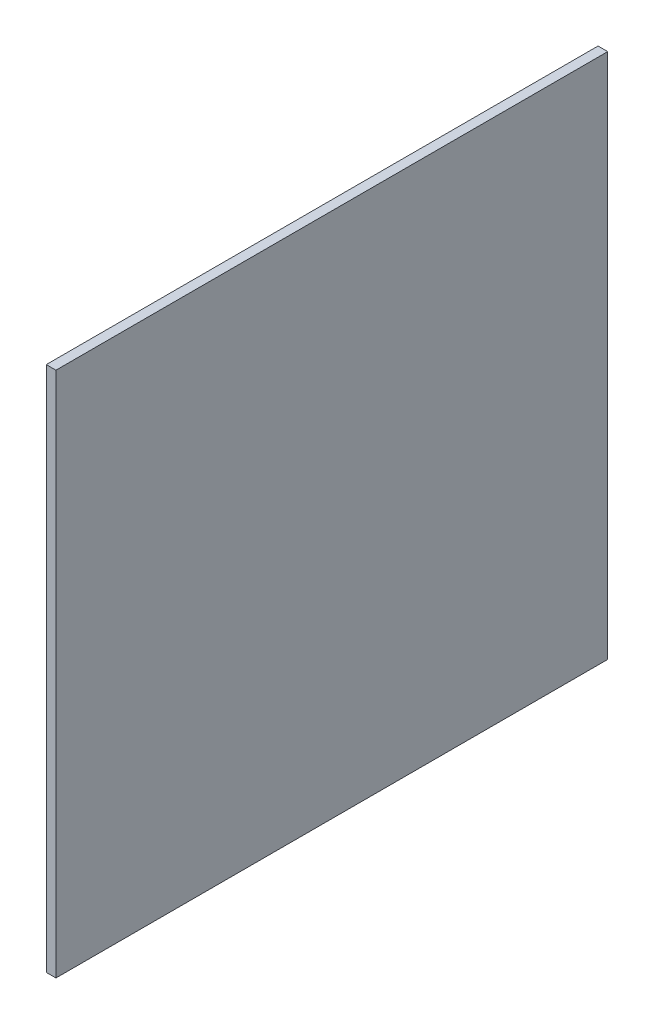
ISO-10303-21;
HEADER;
FILE_DESCRIPTION(('STEP AP214'),'2;1');
FILE_NAME('part.step','',(''),(''),'','','');
FILE_SCHEMA(('AUTOMOTIVE_DESIGN { 1 0 10303 214 1 1 1 1 }'));
ENDSEC;
DATA;
#1=APPLICATION_CONTEXT('core data for automotive mechanical design processes');
#2=APPLICATION_PROTOCOL_DEFINITION('international standard','automotive_design',2000,#1);
#3=PRODUCT_CONTEXT('',#1,'mechanical');
#4=PRODUCT('Part','Part','',(#3));
#5=PRODUCT_RELATED_PRODUCT_CATEGORY('part','',(#4));
#6=PRODUCT_DEFINITION_FORMATION('','',#4);
#7=PRODUCT_DEFINITION_CONTEXT('part definition',#1,'design');
#8=PRODUCT_DEFINITION('design','',#6,#7);
#9=PRODUCT_DEFINITION_SHAPE('','',#8);
#10=(LENGTH_UNIT() NAMED_UNIT(*) SI_UNIT(.MILLI.,.METRE.));
#11=(NAMED_UNIT(*) PLANE_ANGLE_UNIT() SI_UNIT($,.RADIAN.));
#12=(NAMED_UNIT(*) SI_UNIT($,.STERADIAN.) SOLID_ANGLE_UNIT());
#13=UNCERTAINTY_MEASURE_WITH_UNIT(LENGTH_MEASURE(1.E-05),#10,'distance_accuracy_value','');
#14=(GEOMETRIC_REPRESENTATION_CONTEXT(3) GLOBAL_UNCERTAINTY_ASSIGNED_CONTEXT((#13)) GLOBAL_UNIT_ASSIGNED_CONTEXT((#10,
#11,#12)) REPRESENTATION_CONTEXT('',''));
#15=CARTESIAN_POINT('',(0.,0.,0.));
#16=DIRECTION('',(0.,0.,1.));
#17=DIRECTION('',(1.,0.,0.));
#18=AXIS2_PLACEMENT_3D('',#15,#16,#17);
#19=CARTESIAN_POINT('',(0.8,87.,-45.6));
#20=DIRECTION('',(0.,0.,1.));
#21=DIRECTION('',(1.,0.,0.));
#22=AXIS2_PLACEMENT_3D('',#19,#20,#21);
#23=PLANE('',#22);
#24=DIRECTION('',(0.,1.,0.));
#25=VECTOR('',#24,1.);
#26=CARTESIAN_POINT('',(-0.8,87.,-45.6));
#27=LINE('',#26,#25);
#28=CARTESIAN_POINT('',(-0.8,0.,-45.6));
#29=VERTEX_POINT('',#28);
#30=CARTESIAN_POINT('',(-0.8,87.,-45.6));
#31=VERTEX_POINT('',#30);
#32=EDGE_CURVE('E102',#29,#31,#27,.T.);
#33=ORIENTED_EDGE('',*,*,#32,.T.);
#34=DIRECTION('',(-1.,0.,0.));
#35=VECTOR('',#34,1.);
#36=CARTESIAN_POINT('',(0.8,87.,-45.6));
#37=LINE('',#36,#35);
#38=CARTESIAN_POINT('',(0.8,87.,-45.6));
#39=VERTEX_POINT('',#38);
#40=EDGE_CURVE('E11',#39,#31,#37,.T.);
#41=ORIENTED_EDGE('',*,*,#40,.F.);
#42=DIRECTION('',(0.,1.,0.));
#43=VECTOR('',#42,1.);
#44=CARTESIAN_POINT('',(0.8,87.,-45.6));
#45=LINE('',#44,#43);
#46=CARTESIAN_POINT('',(0.8,0.,-45.6));
#47=VERTEX_POINT('',#46);
#48=EDGE_CURVE('E90',#47,#39,#45,.T.);
#49=ORIENTED_EDGE('',*,*,#48,.F.);
#50=DIRECTION('',(-1.,0.,0.));
#51=VECTOR('',#50,1.);
#52=CARTESIAN_POINT('',(0.8,0.,-45.6));
#53=LINE('',#52,#51);
#54=EDGE_CURVE('E98',#47,#29,#53,.T.);
#55=ORIENTED_EDGE('',*,*,#54,.T.);
#56=EDGE_LOOP('',(#33,#41,#49,#55));
#57=FACE_BOUND('',#56,.T.);
#58=ADVANCED_FACE('F39',(#57),#23,.F.);
#59=CARTESIAN_POINT('',(0.8,87.,45.6));
#60=DIRECTION('',(0.,-1.,0.));
#61=DIRECTION('',(0.,0.,-1.));
#62=AXIS2_PLACEMENT_3D('',#59,#60,#61);
#63=PLANE('',#62);
#64=DIRECTION('',(0.,0.,1.));
#65=VECTOR('',#64,1.);
#66=CARTESIAN_POINT('',(-0.8,87.,45.6));
#67=LINE('',#66,#65);
#68=CARTESIAN_POINT('',(-0.8,87.,45.6));
#69=VERTEX_POINT('',#68);
#70=EDGE_CURVE('E94',#31,#69,#67,.T.);
#71=ORIENTED_EDGE('',*,*,#70,.T.);
#72=DIRECTION('',(-1.,0.,0.));
#73=VECTOR('',#72,1.);
#74=CARTESIAN_POINT('',(0.8,87.,45.6));
#75=LINE('',#74,#73);
#76=CARTESIAN_POINT('',(0.8,87.,45.6));
#77=VERTEX_POINT('',#76);
#78=EDGE_CURVE('E47',#77,#69,#75,.T.);
#79=ORIENTED_EDGE('',*,*,#78,.F.);
#80=DIRECTION('',(0.,0.,1.));
#81=VECTOR('',#80,1.);
#82=CARTESIAN_POINT('',(0.8,87.,45.6));
#83=LINE('',#82,#81);
#84=EDGE_CURVE('E85',#39,#77,#83,.T.);
#85=ORIENTED_EDGE('',*,*,#84,.F.);
#86=ORIENTED_EDGE('',*,*,#40,.T.);
#87=EDGE_LOOP('',(#71,#79,#85,#86));
#88=FACE_BOUND('',#87,.T.);
#89=ADVANCED_FACE('F93',(#88),#63,.F.);
#90=CARTESIAN_POINT('',(0.8,0.,45.6));
#91=DIRECTION('',(0.,0.,-1.));
#92=DIRECTION('',(-1.,0.,0.));
#93=AXIS2_PLACEMENT_3D('',#90,#91,#92);
#94=PLANE('',#93);
#95=DIRECTION('',(0.,-1.,0.));
#96=VECTOR('',#95,1.);
#97=CARTESIAN_POINT('',(-0.8,0.,45.6));
#98=LINE('',#97,#96);
#99=CARTESIAN_POINT('',(-0.8,0.,45.6));
#100=VERTEX_POINT('',#99);
#101=EDGE_CURVE('E72',#69,#100,#98,.T.);
#102=ORIENTED_EDGE('',*,*,#101,.T.);
#103=DIRECTION('',(-1.,0.,0.));
#104=VECTOR('',#103,1.);
#105=CARTESIAN_POINT('',(0.8,0.,45.6));
#106=LINE('',#105,#104);
#107=CARTESIAN_POINT('',(0.8,0.,45.6));
#108=VERTEX_POINT('',#107);
#109=EDGE_CURVE('E95',#108,#100,#106,.T.);
#110=ORIENTED_EDGE('',*,*,#109,.F.);
#111=DIRECTION('',(0.,-1.,0.));
#112=VECTOR('',#111,1.);
#113=CARTESIAN_POINT('',(0.8,0.,45.6));
#114=LINE('',#113,#112);
#115=EDGE_CURVE('E88',#77,#108,#114,.T.);
#116=ORIENTED_EDGE('',*,*,#115,.F.);
#117=ORIENTED_EDGE('',*,*,#78,.T.);
#118=EDGE_LOOP('',(#102,#110,#116,#117));
#119=FACE_BOUND('',#118,.T.);
#120=ADVANCED_FACE('F96',(#119),#94,.F.);
#121=CARTESIAN_POINT('',(0.8,0.,-45.6));
#122=DIRECTION('',(0.,1.,0.));
#123=DIRECTION('',(0.,0.,1.));
#124=AXIS2_PLACEMENT_3D('',#121,#122,#123);
#125=PLANE('',#124);
#126=DIRECTION('',(0.,0.,-1.));
#127=VECTOR('',#126,1.);
#128=CARTESIAN_POINT('',(-0.8,0.,-45.6));
#129=LINE('',#128,#127);
#130=EDGE_CURVE('E78',#100,#29,#129,.T.);
#131=ORIENTED_EDGE('',*,*,#130,.T.);
#132=ORIENTED_EDGE('',*,*,#54,.F.);
#133=DIRECTION('',(0.,0.,-1.));
#134=VECTOR('',#133,1.);
#135=CARTESIAN_POINT('',(0.8,0.,-45.6));
#136=LINE('',#135,#134);
#137=EDGE_CURVE('E55',#108,#47,#136,.T.);
#138=ORIENTED_EDGE('',*,*,#137,.F.);
#139=ORIENTED_EDGE('',*,*,#109,.T.);
#140=EDGE_LOOP('',(#131,#132,#138,#139));
#141=FACE_BOUND('',#140,.T.);
#142=ADVANCED_FACE('F109',(#141),#125,.F.);
#143=CARTESIAN_POINT('',(0.8,0.,0.));
#144=DIRECTION('',(-1.,0.,0.));
#145=DIRECTION('',(0.,0.,1.));
#146=AXIS2_PLACEMENT_3D('',#143,#144,#145);
#147=PLANE('',#146);
#148=ORIENTED_EDGE('',*,*,#48,.T.);
#149=ORIENTED_EDGE('',*,*,#84,.T.);
#150=ORIENTED_EDGE('',*,*,#115,.T.);
#151=ORIENTED_EDGE('',*,*,#137,.T.);
#152=EDGE_LOOP('',(#148,#149,#150,#151));
#153=FACE_BOUND('',#152,.T.);
#154=ADVANCED_FACE('F86',(#153),#147,.F.);
#155=CARTESIAN_POINT('',(-0.8,0.,0.));
#156=DIRECTION('',(-1.,0.,0.));
#157=DIRECTION('',(0.,0.,1.));
#158=AXIS2_PLACEMENT_3D('',#155,#156,#157);
#159=PLANE('',#158);
#160=ORIENTED_EDGE('',*,*,#32,.F.);
#161=ORIENTED_EDGE('',*,*,#130,.F.);
#162=ORIENTED_EDGE('',*,*,#101,.F.);
#163=ORIENTED_EDGE('',*,*,#70,.F.);
#164=EDGE_LOOP('',(#160,#161,#162,#163));
#165=FACE_BOUND('',#164,.T.);
#166=ADVANCED_FACE('F112',(#165),#159,.T.);
#167=CLOSED_SHELL('',(#58,#89,#120,#142,#154,#166));
#168=MANIFOLD_SOLID_BREP('B2',#167);
#169=ADVANCED_BREP_SHAPE_REPRESENTATION('',(#18,#168),#14);
#170=SHAPE_DEFINITION_REPRESENTATION(#9,#169);
ENDSEC;
END-ISO-10303-21;
